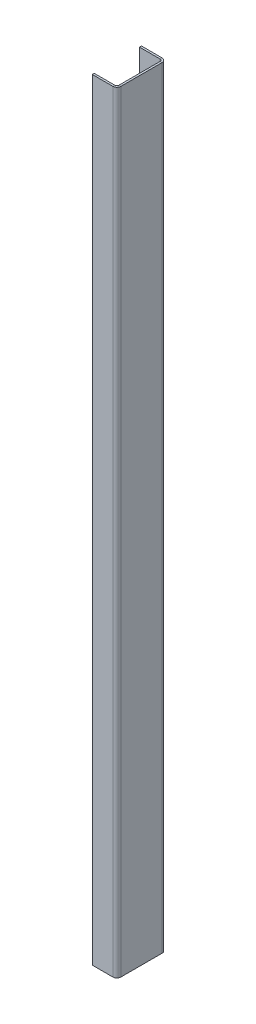
ISO-10303-21;
HEADER;
FILE_DESCRIPTION(('STEP AP214'),'2;1');
FILE_NAME('part.step','',(''),(''),'','','');
FILE_SCHEMA(('AUTOMOTIVE_DESIGN { 1 0 10303 214 1 1 1 1 }'));
ENDSEC;
DATA;
#1=APPLICATION_CONTEXT('core data for automotive mechanical design processes');
#2=APPLICATION_PROTOCOL_DEFINITION('international standard','automotive_design',2000,#1);
#3=PRODUCT_CONTEXT('',#1,'mechanical');
#4=PRODUCT('Part','Part','',(#3));
#5=PRODUCT_RELATED_PRODUCT_CATEGORY('part','',(#4));
#6=PRODUCT_DEFINITION_FORMATION('','',#4);
#7=PRODUCT_DEFINITION_CONTEXT('part definition',#1,'design');
#8=PRODUCT_DEFINITION('design','',#6,#7);
#9=PRODUCT_DEFINITION_SHAPE('','',#8);
#10=(LENGTH_UNIT() NAMED_UNIT(*) SI_UNIT(.MILLI.,.METRE.));
#11=(NAMED_UNIT(*) PLANE_ANGLE_UNIT() SI_UNIT($,.RADIAN.));
#12=(NAMED_UNIT(*) SI_UNIT($,.STERADIAN.) SOLID_ANGLE_UNIT());
#13=UNCERTAINTY_MEASURE_WITH_UNIT(LENGTH_MEASURE(1.E-05),#10,'distance_accuracy_value','');
#14=(GEOMETRIC_REPRESENTATION_CONTEXT(3) GLOBAL_UNCERTAINTY_ASSIGNED_CONTEXT((#13)) GLOBAL_UNIT_ASSIGNED_CONTEXT((#10,
#11,#12)) REPRESENTATION_CONTEXT('',''));
#15=CARTESIAN_POINT('',(0.,0.,0.));
#16=DIRECTION('',(0.,0.,1.));
#17=DIRECTION('',(1.,0.,0.));
#18=AXIS2_PLACEMENT_3D('',#15,#16,#17);
#19=CARTESIAN_POINT('',(0.,596.9,-31.88716));
#20=DIRECTION('',(0.,1.,0.));
#21=DIRECTION('',(0.,0.,1.));
#22=AXIS2_PLACEMENT_3D('',#19,#20,#21);
#23=PLANE('',#22);
#24=DIRECTION('',(-1.,0.,0.));
#25=VECTOR('',#24,1.);
#26=CARTESIAN_POINT('',(0.,596.9,-31.88716));
#27=LINE('',#26,#25);
#28=CARTESIAN_POINT('',(0.,596.9,-31.88716));
#29=VERTEX_POINT('',#28);
#30=CARTESIAN_POINT('',(-3.03784,596.9,-31.88716));
#31=VERTEX_POINT('',#30);
#32=EDGE_CURVE('E11',#29,#31,#27,.T.);
#33=ORIENTED_EDGE('',*,*,#32,.F.);
#34=CARTESIAN_POINT('',(-6.21284000000001,596.9,-31.88716));
#35=DIRECTION('',(0.,1.,0.));
#36=DIRECTION('',(0.,0.,1.));
#37=AXIS2_PLACEMENT_3D('',#34,#35,#36);
#38=CIRCLE('',#37,6.21284);
#39=CARTESIAN_POINT('',(-6.21284000000003,596.9,-38.1));
#40=VERTEX_POINT('',#39);
#41=EDGE_CURVE('E247',#40,#29,#38,.F.);
#42=ORIENTED_EDGE('',*,*,#41,.F.);
#43=DIRECTION('',(0.,0.,-1.));
#44=VECTOR('',#43,1.);
#45=CARTESIAN_POINT('',(-6.21284000000002,596.9,-35.06216));
#46=LINE('',#45,#44);
#47=CARTESIAN_POINT('',(-6.21284000000002,596.9,-35.06216));
#48=VERTEX_POINT('',#47);
#49=EDGE_CURVE('E45',#48,#40,#46,.T.);
#50=ORIENTED_EDGE('',*,*,#49,.F.);
#51=CARTESIAN_POINT('',(-6.21284000000001,596.9,-31.88716));
#52=DIRECTION('',(0.,1.,0.));
#53=DIRECTION('',(1.,0.,0.));
#54=AXIS2_PLACEMENT_3D('',#51,#52,#53);
#55=CIRCLE('',#54,3.175);
#56=EDGE_CURVE('E146',#48,#31,#55,.F.);
#57=ORIENTED_EDGE('',*,*,#56,.T.);
#58=EDGE_LOOP('',(#33,#42,#50,#57));
#59=FACE_BOUND('',#58,.T.);
#60=ADVANCED_FACE('F37',(#59),#23,.T.);
#61=CARTESIAN_POINT('',(-6.21284000000002,596.9,-35.06216));
#62=DIRECTION('',(0.,1.,0.));
#63=DIRECTION('',(0.,0.,1.));
#64=AXIS2_PLACEMENT_3D('',#61,#62,#63);
#65=PLANE('',#64);
#66=DIRECTION('',(0.,0.,1.));
#67=VECTOR('',#66,1.);
#68=CARTESIAN_POINT('',(0.,596.9,-38.1));
#69=LINE('',#68,#67);
#70=CARTESIAN_POINT('',(0.,596.9,31.8871599999999));
#71=VERTEX_POINT('',#70);
#72=EDGE_CURVE('E140',#29,#71,#69,.T.);
#73=ORIENTED_EDGE('',*,*,#72,.F.);
#74=ORIENTED_EDGE('',*,*,#32,.T.);
#75=DIRECTION('',(0.,0.,-1.));
#76=VECTOR('',#75,1.);
#77=CARTESIAN_POINT('',(-3.03784,596.9,-38.1));
#78=LINE('',#77,#76);
#79=CARTESIAN_POINT('',(-3.03784,596.9,31.88716));
#80=VERTEX_POINT('',#79);
#81=EDGE_CURVE('E137',#31,#80,#78,.F.);
#82=ORIENTED_EDGE('',*,*,#81,.T.);
#83=DIRECTION('',(1.,0.,0.));
#84=VECTOR('',#83,1.);
#85=CARTESIAN_POINT('',(-3.03784,596.9,31.88716));
#86=LINE('',#85,#84);
#87=EDGE_CURVE('E228',#80,#71,#86,.T.);
#88=ORIENTED_EDGE('',*,*,#87,.T.);
#89=EDGE_LOOP('',(#73,#74,#82,#88));
#90=FACE_BOUND('',#89,.T.);
#91=ADVANCED_FACE('F135',(#90),#65,.T.);
#92=CARTESIAN_POINT('',(-6.21284000000003,-596.9,-38.1));
#93=DIRECTION('',(0.,-1.,0.));
#94=DIRECTION('',(0.,0.,-1.));
#95=AXIS2_PLACEMENT_3D('',#92,#93,#94);
#96=PLANE('',#95);
#97=DIRECTION('',(0.,0.,1.));
#98=VECTOR('',#97,1.);
#99=CARTESIAN_POINT('',(-6.21284000000003,-596.9,-38.1));
#100=LINE('',#99,#98);
#101=CARTESIAN_POINT('',(-6.21284000000003,-596.9,-38.1));
#102=VERTEX_POINT('',#101);
#103=CARTESIAN_POINT('',(-6.21284000000002,-596.9,-35.06216));
#104=VERTEX_POINT('',#103);
#105=EDGE_CURVE('E233',#102,#104,#100,.T.);
#106=ORIENTED_EDGE('',*,*,#105,.F.);
#107=CARTESIAN_POINT('',(-6.21284000000001,-596.9,-31.88716));
#108=DIRECTION('',(0.,1.,0.));
#109=DIRECTION('',(0.,0.,1.));
#110=AXIS2_PLACEMENT_3D('',#107,#108,#109);
#111=CIRCLE('',#110,6.21284);
#112=CARTESIAN_POINT('',(0.,-596.9,-31.88716));
#113=VERTEX_POINT('',#112);
#114=EDGE_CURVE('E185',#102,#113,#111,.F.);
#115=ORIENTED_EDGE('',*,*,#114,.T.);
#116=DIRECTION('',(1.,0.,0.));
#117=VECTOR('',#116,1.);
#118=CARTESIAN_POINT('',(-3.03784,-596.9,-31.88716));
#119=LINE('',#118,#117);
#120=CARTESIAN_POINT('',(-3.03784,-596.9,-31.88716));
#121=VERTEX_POINT('',#120);
#122=EDGE_CURVE('E231',#121,#113,#119,.T.);
#123=ORIENTED_EDGE('',*,*,#122,.F.);
#124=CARTESIAN_POINT('',(-6.21284000000001,-596.9,-31.88716));
#125=DIRECTION('',(0.,1.,0.));
#126=DIRECTION('',(1.,0.,0.));
#127=AXIS2_PLACEMENT_3D('',#124,#125,#126);
#128=CIRCLE('',#127,3.175);
#129=EDGE_CURVE('E158',#104,#121,#128,.F.);
#130=ORIENTED_EDGE('',*,*,#129,.F.);
#131=EDGE_LOOP('',(#106,#115,#123,#130));
#132=FACE_BOUND('',#131,.T.);
#133=ADVANCED_FACE('F285',(#132),#96,.T.);
#134=CARTESIAN_POINT('',(-3.03784,-596.9,-31.88716));
#135=DIRECTION('',(0.,-1.,0.));
#136=DIRECTION('',(0.,0.,-1.));
#137=AXIS2_PLACEMENT_3D('',#134,#135,#136);
#138=PLANE('',#137);
#139=DIRECTION('',(1.,0.,0.));
#140=VECTOR('',#139,1.);
#141=CARTESIAN_POINT('',(-38.1,-596.9,-38.1));
#142=LINE('',#141,#140);
#143=CARTESIAN_POINT('',(-38.1,-596.9,-38.1));
#144=VERTEX_POINT('',#143);
#145=EDGE_CURVE('E188',#144,#102,#142,.T.);
#146=ORIENTED_EDGE('',*,*,#145,.T.);
#147=ORIENTED_EDGE('',*,*,#105,.T.);
#148=DIRECTION('',(1.,0.,0.));
#149=VECTOR('',#148,1.);
#150=CARTESIAN_POINT('',(-38.1,-596.9,-35.06216));
#151=LINE('',#150,#149);
#152=CARTESIAN_POINT('',(-38.1,-596.9,-35.06216));
#153=VERTEX_POINT('',#152);
#154=EDGE_CURVE('E194',#153,#104,#151,.T.);
#155=ORIENTED_EDGE('',*,*,#154,.F.);
#156=DIRECTION('',(0.,0.,-1.));
#157=VECTOR('',#156,1.);
#158=CARTESIAN_POINT('',(-38.1,-596.9,-35.06216));
#159=LINE('',#158,#157);
#160=EDGE_CURVE('E191',#153,#144,#159,.T.);
#161=ORIENTED_EDGE('',*,*,#160,.T.);
#162=EDGE_LOOP('',(#146,#147,#155,#161));
#163=FACE_BOUND('',#162,.T.);
#164=ADVANCED_FACE('F288',(#163),#138,.T.);
#165=CARTESIAN_POINT('',(-6.21284,596.9,38.1));
#166=DIRECTION('',(0.,1.,0.));
#167=DIRECTION('',(0.,0.,1.));
#168=AXIS2_PLACEMENT_3D('',#165,#166,#167);
#169=PLANE('',#168);
#170=DIRECTION('',(0.,0.,-1.));
#171=VECTOR('',#170,1.);
#172=CARTESIAN_POINT('',(-6.21284,596.9,38.1));
#173=LINE('',#172,#171);
#174=CARTESIAN_POINT('',(-6.21284,596.9,38.1));
#175=VERTEX_POINT('',#174);
#176=CARTESIAN_POINT('',(-6.21284,596.9,35.06216));
#177=VERTEX_POINT('',#176);
#178=EDGE_CURVE('E53',#175,#177,#173,.T.);
#179=ORIENTED_EDGE('',*,*,#178,.F.);
#180=CARTESIAN_POINT('',(-6.21284,596.9,31.88716));
#181=DIRECTION('',(0.,1.,0.));
#182=DIRECTION('',(0.,0.,1.));
#183=AXIS2_PLACEMENT_3D('',#180,#181,#182);
#184=CIRCLE('',#183,6.21284);
#185=EDGE_CURVE('E257',#71,#175,#184,.F.);
#186=ORIENTED_EDGE('',*,*,#185,.F.);
#187=ORIENTED_EDGE('',*,*,#87,.F.);
#188=CARTESIAN_POINT('',(-6.21284,596.9,31.88716));
#189=DIRECTION('',(0.,1.,0.));
#190=DIRECTION('',(1.,0.,0.));
#191=AXIS2_PLACEMENT_3D('',#188,#189,#190);
#192=CIRCLE('',#191,3.175);
#193=EDGE_CURVE('E166',#80,#177,#192,.F.);
#194=ORIENTED_EDGE('',*,*,#193,.T.);
#195=EDGE_LOOP('',(#179,#186,#187,#194));
#196=FACE_BOUND('',#195,.T.);
#197=ADVANCED_FACE('F280',(#196),#169,.T.);
#198=CARTESIAN_POINT('',(-3.03784,596.9,31.88716));
#199=DIRECTION('',(0.,1.,0.));
#200=DIRECTION('',(0.,0.,1.));
#201=AXIS2_PLACEMENT_3D('',#198,#199,#200);
#202=PLANE('',#201);
#203=DIRECTION('',(-1.,0.,0.));
#204=VECTOR('',#203,1.);
#205=CARTESIAN_POINT('',(0.,596.9,38.1));
#206=LINE('',#205,#204);
#207=CARTESIAN_POINT('',(-38.1,596.9,38.1));
#208=VERTEX_POINT('',#207);
#209=EDGE_CURVE('E260',#175,#208,#206,.T.);
#210=ORIENTED_EDGE('',*,*,#209,.F.);
#211=ORIENTED_EDGE('',*,*,#178,.T.);
#212=DIRECTION('',(1.,0.,0.));
#213=VECTOR('',#212,1.);
#214=CARTESIAN_POINT('',(0.,596.9,35.06216));
#215=LINE('',#214,#213);
#216=CARTESIAN_POINT('',(-38.1,596.9,35.06216));
#217=VERTEX_POINT('',#216);
#218=EDGE_CURVE('E107',#177,#217,#215,.F.);
#219=ORIENTED_EDGE('',*,*,#218,.T.);
#220=DIRECTION('',(0.,0.,-1.));
#221=VECTOR('',#220,1.);
#222=CARTESIAN_POINT('',(-38.1,596.9,38.1));
#223=LINE('',#222,#221);
#224=EDGE_CURVE('E263',#208,#217,#223,.T.);
#225=ORIENTED_EDGE('',*,*,#224,.F.);
#226=EDGE_LOOP('',(#210,#211,#219,#225));
#227=FACE_BOUND('',#226,.T.);
#228=ADVANCED_FACE('F269',(#227),#202,.T.);
#229=CARTESIAN_POINT('',(0.,-596.9,31.8871599999999));
#230=DIRECTION('',(0.,-1.,0.));
#231=DIRECTION('',(0.,0.,-1.));
#232=AXIS2_PLACEMENT_3D('',#229,#230,#231);
#233=PLANE('',#232);
#234=DIRECTION('',(-1.,0.,0.));
#235=VECTOR('',#234,1.);
#236=CARTESIAN_POINT('',(0.,-596.9,31.8871599999999));
#237=LINE('',#236,#235);
#238=CARTESIAN_POINT('',(0.,-596.9,31.8871599999999));
#239=VERTEX_POINT('',#238);
#240=CARTESIAN_POINT('',(-3.03784,-596.9,31.88716));
#241=VERTEX_POINT('',#240);
#242=EDGE_CURVE('E94',#239,#241,#237,.T.);
#243=ORIENTED_EDGE('',*,*,#242,.F.);
#244=CARTESIAN_POINT('',(-6.21284,-596.9,31.88716));
#245=DIRECTION('',(0.,1.,0.));
#246=DIRECTION('',(0.,0.,1.));
#247=AXIS2_PLACEMENT_3D('',#244,#245,#246);
#248=CIRCLE('',#247,6.21284);
#249=CARTESIAN_POINT('',(-6.21284,-596.9,38.1));
#250=VERTEX_POINT('',#249);
#251=EDGE_CURVE('E181',#239,#250,#248,.F.);
#252=ORIENTED_EDGE('',*,*,#251,.T.);
#253=DIRECTION('',(0.,0.,1.));
#254=VECTOR('',#253,1.);
#255=CARTESIAN_POINT('',(-6.21284,-596.9,35.06216));
#256=LINE('',#255,#254);
#257=CARTESIAN_POINT('',(-6.21284,-596.9,35.06216));
#258=VERTEX_POINT('',#257);
#259=EDGE_CURVE('E101',#258,#250,#256,.T.);
#260=ORIENTED_EDGE('',*,*,#259,.F.);
#261=CARTESIAN_POINT('',(-6.21284,-596.9,31.88716));
#262=DIRECTION('',(0.,1.,0.));
#263=DIRECTION('',(1.,0.,0.));
#264=AXIS2_PLACEMENT_3D('',#261,#262,#263);
#265=CIRCLE('',#264,3.175);
#266=EDGE_CURVE('E200',#241,#258,#265,.F.);
#267=ORIENTED_EDGE('',*,*,#266,.F.);
#268=EDGE_LOOP('',(#243,#252,#260,#267));
#269=FACE_BOUND('',#268,.T.);
#270=ADVANCED_FACE('F317',(#269),#233,.T.);
#271=CARTESIAN_POINT('',(-6.21284,-596.9,35.06216));
#272=DIRECTION('',(0.,-1.,0.));
#273=DIRECTION('',(0.,0.,-1.));
#274=AXIS2_PLACEMENT_3D('',#271,#272,#273);
#275=PLANE('',#274);
#276=DIRECTION('',(0.,0.,1.));
#277=VECTOR('',#276,1.);
#278=CARTESIAN_POINT('',(0.,-596.9,-38.1));
#279=LINE('',#278,#277);
#280=EDGE_CURVE('E183',#113,#239,#279,.T.);
#281=ORIENTED_EDGE('',*,*,#280,.T.);
#282=ORIENTED_EDGE('',*,*,#242,.T.);
#283=DIRECTION('',(0.,0.,-1.));
#284=VECTOR('',#283,1.);
#285=CARTESIAN_POINT('',(-3.03784,-596.9,-38.1));
#286=LINE('',#285,#284);
#287=EDGE_CURVE('E198',#121,#241,#286,.F.);
#288=ORIENTED_EDGE('',*,*,#287,.F.);
#289=ORIENTED_EDGE('',*,*,#122,.T.);
#290=EDGE_LOOP('',(#281,#282,#288,#289));
#291=FACE_BOUND('',#290,.T.);
#292=ADVANCED_FACE('F320',(#291),#275,.T.);
#293=CARTESIAN_POINT('',(0.,596.9,35.06216));
#294=DIRECTION('',(0.,0.,1.));
#295=DIRECTION('',(1.,0.,0.));
#296=AXIS2_PLACEMENT_3D('',#293,#294,#295);
#297=PLANE('',#296);
#298=DIRECTION('',(1.,0.,0.));
#299=VECTOR('',#298,1.);
#300=CARTESIAN_POINT('',(0.,-596.9,35.06216));
#301=LINE('',#300,#299);
#302=CARTESIAN_POINT('',(-38.1,-596.9,35.06216));
#303=VERTEX_POINT('',#302);
#304=EDGE_CURVE('E172',#258,#303,#301,.F.);
#305=ORIENTED_EDGE('',*,*,#304,.T.);
#306=DIRECTION('',(0.,-1.,0.));
#307=VECTOR('',#306,1.);
#308=CARTESIAN_POINT('',(-38.1,596.9,35.06216));
#309=LINE('',#308,#307);
#310=EDGE_CURVE('E224',#217,#303,#309,.T.);
#311=ORIENTED_EDGE('',*,*,#310,.F.);
#312=ORIENTED_EDGE('',*,*,#218,.F.);
#313=DIRECTION('',(0.,-1.,0.));
#314=VECTOR('',#313,1.);
#315=CARTESIAN_POINT('',(-6.21284,596.9,35.06216));
#316=LINE('',#315,#314);
#317=EDGE_CURVE('E168',#177,#258,#316,.T.);
#318=ORIENTED_EDGE('',*,*,#317,.T.);
#319=EDGE_LOOP('',(#305,#311,#312,#318));
#320=FACE_BOUND('',#319,.T.);
#321=ADVANCED_FACE('F323',(#320),#297,.F.);
#322=CARTESIAN_POINT('',(-38.1,596.9,38.1));
#323=DIRECTION('',(-1.,0.,0.));
#324=DIRECTION('',(0.,0.,1.));
#325=AXIS2_PLACEMENT_3D('',#322,#323,#324);
#326=PLANE('',#325);
#327=DIRECTION('',(0.,0.,-1.));
#328=VECTOR('',#327,1.);
#329=CARTESIAN_POINT('',(-38.1,-596.9,38.1));
#330=LINE('',#329,#328);
#331=CARTESIAN_POINT('',(-38.1,-596.9,38.1));
#332=VERTEX_POINT('',#331);
#333=EDGE_CURVE('E175',#332,#303,#330,.T.);
#334=ORIENTED_EDGE('',*,*,#333,.F.);
#335=DIRECTION('',(0.,-1.,0.));
#336=VECTOR('',#335,1.);
#337=CARTESIAN_POINT('',(-38.1,596.9,38.1));
#338=LINE('',#337,#336);
#339=EDGE_CURVE('E222',#208,#332,#338,.T.);
#340=ORIENTED_EDGE('',*,*,#339,.F.);
#341=ORIENTED_EDGE('',*,*,#224,.T.);
#342=ORIENTED_EDGE('',*,*,#310,.T.);
#343=EDGE_LOOP('',(#334,#340,#341,#342));
#344=FACE_BOUND('',#343,.T.);
#345=ADVANCED_FACE('F268',(#344),#326,.T.);
#346=CARTESIAN_POINT('',(0.,596.9,38.1));
#347=DIRECTION('',(0.,0.,1.));
#348=DIRECTION('',(1.,0.,0.));
#349=AXIS2_PLACEMENT_3D('',#346,#347,#348);
#350=PLANE('',#349);
#351=DIRECTION('',(-1.,0.,0.));
#352=VECTOR('',#351,1.);
#353=CARTESIAN_POINT('',(0.,-596.9,38.1));
#354=LINE('',#353,#352);
#355=EDGE_CURVE('E178',#250,#332,#354,.T.);
#356=ORIENTED_EDGE('',*,*,#355,.F.);
#357=DIRECTION('',(0.,-1.,0.));
#358=VECTOR('',#357,1.);
#359=CARTESIAN_POINT('',(-6.21284,596.9,38.1));
#360=LINE('',#359,#358);
#361=EDGE_CURVE('E219',#175,#250,#360,.T.);
#362=ORIENTED_EDGE('',*,*,#361,.F.);
#363=ORIENTED_EDGE('',*,*,#209,.T.);
#364=ORIENTED_EDGE('',*,*,#339,.T.);
#365=EDGE_LOOP('',(#356,#362,#363,#364));
#366=FACE_BOUND('',#365,.T.);
#367=ADVANCED_FACE('F273',(#366),#350,.T.);
#368=CARTESIAN_POINT('',(-6.21284,596.9,31.88716));
#369=DIRECTION('',(0.,-1.,0.));
#370=DIRECTION('',(0.,0.,-1.));
#371=AXIS2_PLACEMENT_3D('',#368,#369,#370);
#372=CYLINDRICAL_SURFACE('',#371,6.21284);
#373=ORIENTED_EDGE('',*,*,#251,.F.);
#374=DIRECTION('',(0.,-1.,0.));
#375=VECTOR('',#374,1.);
#376=CARTESIAN_POINT('',(0.,596.9,31.8871599999999));
#377=LINE('',#376,#375);
#378=EDGE_CURVE('E216',#71,#239,#377,.T.);
#379=ORIENTED_EDGE('',*,*,#378,.F.);
#380=ORIENTED_EDGE('',*,*,#185,.T.);
#381=ORIENTED_EDGE('',*,*,#361,.T.);
#382=EDGE_LOOP('',(#373,#379,#380,#381));
#383=FACE_BOUND('',#382,.T.);
#384=ADVANCED_FACE('F276',(#383),#372,.T.);
#385=CARTESIAN_POINT('',(0.,596.9,-38.1));
#386=DIRECTION('',(1.,0.,0.));
#387=DIRECTION('',(0.,0.,-1.));
#388=AXIS2_PLACEMENT_3D('',#385,#386,#387);
#389=PLANE('',#388);
#390=ORIENTED_EDGE('',*,*,#280,.F.);
#391=DIRECTION('',(0.,-1.,0.));
#392=VECTOR('',#391,1.);
#393=CARTESIAN_POINT('',(0.,596.9,-31.88716));
#394=LINE('',#393,#392);
#395=EDGE_CURVE('E213',#29,#113,#394,.T.);
#396=ORIENTED_EDGE('',*,*,#395,.F.);
#397=ORIENTED_EDGE('',*,*,#72,.T.);
#398=ORIENTED_EDGE('',*,*,#378,.T.);
#399=EDGE_LOOP('',(#390,#396,#397,#398));
#400=FACE_BOUND('',#399,.T.);
#401=ADVANCED_FACE('F283',(#400),#389,.T.);
#402=CARTESIAN_POINT('',(-6.21284000000001,596.9,-31.88716));
#403=DIRECTION('',(0.,-1.,0.));
#404=DIRECTION('',(0.,0.,-1.));
#405=AXIS2_PLACEMENT_3D('',#402,#403,#404);
#406=CYLINDRICAL_SURFACE('',#405,6.21284);
#407=ORIENTED_EDGE('',*,*,#114,.F.);
#408=DIRECTION('',(0.,-1.,0.));
#409=VECTOR('',#408,1.);
#410=CARTESIAN_POINT('',(-6.21284000000003,596.9,-38.1));
#411=LINE('',#410,#409);
#412=EDGE_CURVE('E210',#40,#102,#411,.T.);
#413=ORIENTED_EDGE('',*,*,#412,.F.);
#414=ORIENTED_EDGE('',*,*,#41,.T.);
#415=ORIENTED_EDGE('',*,*,#395,.T.);
#416=EDGE_LOOP('',(#407,#413,#414,#415));
#417=FACE_BOUND('',#416,.T.);
#418=ADVANCED_FACE('F246',(#417),#406,.T.);
#419=CARTESIAN_POINT('',(-38.1,596.9,-38.1));
#420=DIRECTION('',(0.,0.,-1.));
#421=DIRECTION('',(-1.,0.,0.));
#422=AXIS2_PLACEMENT_3D('',#419,#420,#421);
#423=PLANE('',#422);
#424=ORIENTED_EDGE('',*,*,#145,.F.);
#425=DIRECTION('',(0.,-1.,0.));
#426=VECTOR('',#425,1.);
#427=CARTESIAN_POINT('',(-38.1,596.9,-38.1));
#428=LINE('',#427,#426);
#429=CARTESIAN_POINT('',(-38.1,596.9,-38.1));
#430=VERTEX_POINT('',#429);
#431=EDGE_CURVE('E208',#430,#144,#428,.T.);
#432=ORIENTED_EDGE('',*,*,#431,.F.);
#433=DIRECTION('',(1.,0.,0.));
#434=VECTOR('',#433,1.);
#435=CARTESIAN_POINT('',(-38.1,596.9,-38.1));
#436=LINE('',#435,#434);
#437=EDGE_CURVE('E240',#430,#40,#436,.T.);
#438=ORIENTED_EDGE('',*,*,#437,.T.);
#439=ORIENTED_EDGE('',*,*,#412,.T.);
#440=EDGE_LOOP('',(#424,#432,#438,#439));
#441=FACE_BOUND('',#440,.T.);
#442=ADVANCED_FACE('F251',(#441),#423,.T.);
#443=CARTESIAN_POINT('',(-38.1,596.9,-35.06216));
#444=DIRECTION('',(-1.,0.,0.));
#445=DIRECTION('',(0.,0.,1.));
#446=AXIS2_PLACEMENT_3D('',#443,#444,#445);
#447=PLANE('',#446);
#448=ORIENTED_EDGE('',*,*,#160,.F.);
#449=DIRECTION('',(0.,-1.,0.));
#450=VECTOR('',#449,1.);
#451=CARTESIAN_POINT('',(-38.1,596.9,-35.06216));
#452=LINE('',#451,#450);
#453=CARTESIAN_POINT('',(-38.1,596.9,-35.06216));
#454=VERTEX_POINT('',#453);
#455=EDGE_CURVE('E206',#454,#153,#452,.T.);
#456=ORIENTED_EDGE('',*,*,#455,.F.);
#457=DIRECTION('',(0.,0.,-1.));
#458=VECTOR('',#457,1.);
#459=CARTESIAN_POINT('',(-38.1,596.9,-35.06216));
#460=LINE('',#459,#458);
#461=EDGE_CURVE('E252',#454,#430,#460,.T.);
#462=ORIENTED_EDGE('',*,*,#461,.T.);
#463=ORIENTED_EDGE('',*,*,#431,.T.);
#464=EDGE_LOOP('',(#448,#456,#462,#463));
#465=FACE_BOUND('',#464,.T.);
#466=ADVANCED_FACE('F293',(#465),#447,.T.);
#467=CARTESIAN_POINT('',(-38.1,596.9,-35.06216));
#468=DIRECTION('',(0.,0.,-1.));
#469=DIRECTION('',(-1.,0.,0.));
#470=AXIS2_PLACEMENT_3D('',#467,#468,#469);
#471=PLANE('',#470);
#472=ORIENTED_EDGE('',*,*,#154,.T.);
#473=DIRECTION('',(0.,-1.,0.));
#474=VECTOR('',#473,1.);
#475=CARTESIAN_POINT('',(-6.21284000000002,596.9,-35.06216));
#476=LINE('',#475,#474);
#477=EDGE_CURVE('E160',#48,#104,#476,.T.);
#478=ORIENTED_EDGE('',*,*,#477,.F.);
#479=DIRECTION('',(1.,0.,0.));
#480=VECTOR('',#479,1.);
#481=CARTESIAN_POINT('',(-38.1,596.9,-35.06216));
#482=LINE('',#481,#480);
#483=EDGE_CURVE('E151',#454,#48,#482,.T.);
#484=ORIENTED_EDGE('',*,*,#483,.F.);
#485=ORIENTED_EDGE('',*,*,#455,.T.);
#486=EDGE_LOOP('',(#472,#478,#484,#485));
#487=FACE_BOUND('',#486,.T.);
#488=ADVANCED_FACE('F291',(#487),#471,.F.);
#489=CARTESIAN_POINT('',(-6.21284000000001,596.9,-31.88716));
#490=DIRECTION('',(0.,-1.,0.));
#491=DIRECTION('',(0.,0.,-1.));
#492=AXIS2_PLACEMENT_3D('',#489,#490,#491);
#493=CYLINDRICAL_SURFACE('',#492,3.175);
#494=ORIENTED_EDGE('',*,*,#129,.T.);
#495=DIRECTION('',(0.,-1.,0.));
#496=VECTOR('',#495,1.);
#497=CARTESIAN_POINT('',(-3.03784,596.9,-31.88716));
#498=LINE('',#497,#496);
#499=EDGE_CURVE('E155',#31,#121,#498,.T.);
#500=ORIENTED_EDGE('',*,*,#499,.F.);
#501=ORIENTED_EDGE('',*,*,#56,.F.);
#502=ORIENTED_EDGE('',*,*,#477,.T.);
#503=EDGE_LOOP('',(#494,#500,#501,#502));
#504=FACE_BOUND('',#503,.T.);
#505=ADVANCED_FACE('F156',(#504),#493,.F.);
#506=CARTESIAN_POINT('',(-3.03784,596.9,-38.1));
#507=DIRECTION('',(1.,0.,0.));
#508=DIRECTION('',(0.,0.,-1.));
#509=AXIS2_PLACEMENT_3D('',#506,#507,#508);
#510=PLANE('',#509);
#511=ORIENTED_EDGE('',*,*,#287,.T.);
#512=DIRECTION('',(0.,-1.,0.));
#513=VECTOR('',#512,1.);
#514=CARTESIAN_POINT('',(-3.03784,596.9,31.88716));
#515=LINE('',#514,#513);
#516=EDGE_CURVE('E161',#80,#241,#515,.T.);
#517=ORIENTED_EDGE('',*,*,#516,.F.);
#518=ORIENTED_EDGE('',*,*,#81,.F.);
#519=ORIENTED_EDGE('',*,*,#499,.T.);
#520=EDGE_LOOP('',(#511,#517,#518,#519));
#521=FACE_BOUND('',#520,.T.);
#522=ADVANCED_FACE('F163',(#521),#510,.F.);
#523=CARTESIAN_POINT('',(-6.21284,596.9,31.88716));
#524=DIRECTION('',(0.,-1.,0.));
#525=DIRECTION('',(0.,0.,-1.));
#526=AXIS2_PLACEMENT_3D('',#523,#524,#525);
#527=CYLINDRICAL_SURFACE('',#526,3.175);
#528=ORIENTED_EDGE('',*,*,#266,.T.);
#529=ORIENTED_EDGE('',*,*,#317,.F.);
#530=ORIENTED_EDGE('',*,*,#193,.F.);
#531=ORIENTED_EDGE('',*,*,#516,.T.);
#532=EDGE_LOOP('',(#528,#529,#530,#531));
#533=FACE_BOUND('',#532,.T.);
#534=ADVANCED_FACE('F375',(#533),#527,.F.);
#535=CARTESIAN_POINT('',(-6.21284,596.9,31.88716));
#536=DIRECTION('',(0.,1.,0.));
#537=DIRECTION('',(1.,0.,0.));
#538=AXIS2_PLACEMENT_3D('',#535,#536,#537);
#539=PLANE('',#538);
#540=ORIENTED_EDGE('',*,*,#483,.T.);
#541=ORIENTED_EDGE('',*,*,#49,.T.);
#542=ORIENTED_EDGE('',*,*,#437,.F.);
#543=ORIENTED_EDGE('',*,*,#461,.F.);
#544=EDGE_LOOP('',(#540,#541,#542,#543));
#545=FACE_BOUND('',#544,.T.);
#546=ADVANCED_FACE('F237',(#545),#539,.T.);
#547=CARTESIAN_POINT('',(-6.21284,-596.9,31.88716));
#548=DIRECTION('',(0.,1.,0.));
#549=DIRECTION('',(1.,0.,0.));
#550=AXIS2_PLACEMENT_3D('',#547,#548,#549);
#551=PLANE('',#550);
#552=ORIENTED_EDGE('',*,*,#304,.F.);
#553=ORIENTED_EDGE('',*,*,#259,.T.);
#554=ORIENTED_EDGE('',*,*,#355,.T.);
#555=ORIENTED_EDGE('',*,*,#333,.T.);
#556=EDGE_LOOP('',(#552,#553,#554,#555));
#557=FACE_BOUND('',#556,.T.);
#558=ADVANCED_FACE('F395',(#557),#551,.F.);
#559=CLOSED_SHELL('',(#60,#91,#133,#164,#197,#228,#270,#292,#321,#345,#367,#384,#401,#418,#442,
#466,#488,#505,#522,#534,#546,#558));
#560=MANIFOLD_SOLID_BREP('B2',#559);
#561=ADVANCED_BREP_SHAPE_REPRESENTATION('',(#18,#560),#14);
#562=SHAPE_DEFINITION_REPRESENTATION(#9,#561);
ENDSEC;
END-ISO-10303-21;
